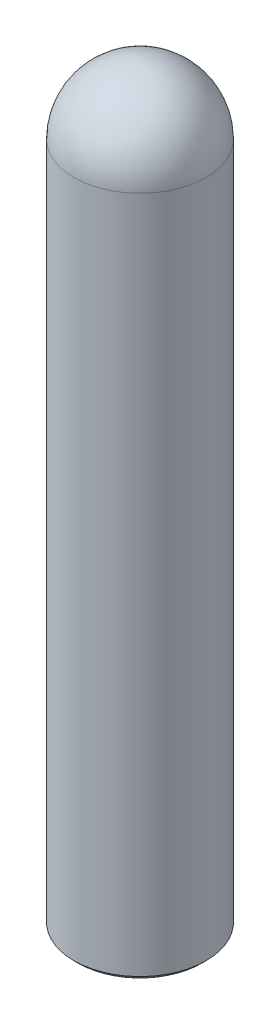
ISO-10303-21;
HEADER;
FILE_DESCRIPTION(('STEP AP214'),'2;1');
FILE_NAME('part.step','',(''),(''),'','','');
FILE_SCHEMA(('AUTOMOTIVE_DESIGN { 1 0 10303 214 1 1 1 1 }'));
ENDSEC;
DATA;
#1=APPLICATION_CONTEXT('core data for automotive mechanical design processes');
#2=APPLICATION_PROTOCOL_DEFINITION('international standard','automotive_design',2000,#1);
#3=PRODUCT_CONTEXT('',#1,'mechanical');
#4=PRODUCT('Part','Part','',(#3));
#5=PRODUCT_RELATED_PRODUCT_CATEGORY('part','',(#4));
#6=PRODUCT_DEFINITION_FORMATION('','',#4);
#7=PRODUCT_DEFINITION_CONTEXT('part definition',#1,'design');
#8=PRODUCT_DEFINITION('design','',#6,#7);
#9=PRODUCT_DEFINITION_SHAPE('','',#8);
#10=(LENGTH_UNIT() NAMED_UNIT(*) SI_UNIT(.MILLI.,.METRE.));
#11=(NAMED_UNIT(*) PLANE_ANGLE_UNIT() SI_UNIT($,.RADIAN.));
#12=(NAMED_UNIT(*) SI_UNIT($,.STERADIAN.) SOLID_ANGLE_UNIT());
#13=UNCERTAINTY_MEASURE_WITH_UNIT(LENGTH_MEASURE(1.E-05),#10,'distance_accuracy_value','');
#14=(GEOMETRIC_REPRESENTATION_CONTEXT(3) GLOBAL_UNCERTAINTY_ASSIGNED_CONTEXT((#13)) GLOBAL_UNIT_ASSIGNED_CONTEXT((#10,
#11,#12)) REPRESENTATION_CONTEXT('',''));
#15=CARTESIAN_POINT('',(0.,0.,0.));
#16=DIRECTION('',(0.,0.,1.));
#17=DIRECTION('',(1.,0.,0.));
#18=AXIS2_PLACEMENT_3D('',#15,#16,#17);
#19=CARTESIAN_POINT('',(0.,170.,0.));
#20=DIRECTION('',(0.,-1.,0.));
#21=DIRECTION('',(0.,0.,-1.));
#22=AXIS2_PLACEMENT_3D('',#19,#20,#21);
#23=CYLINDRICAL_SURFACE('',#22,15.);
#24=CARTESIAN_POINT('',(0.,1.00000000000003,0.));
#25=DIRECTION('',(0.,1.,0.));
#26=DIRECTION('',(0.,0.,1.));
#27=AXIS2_PLACEMENT_3D('',#24,#25,#26);
#28=CIRCLE('',#27,15.);
#29=CARTESIAN_POINT('',(0.,1.00000000000003,15.));
#30=VERTEX_POINT('',#29);
#31=EDGE_CURVE('E41',#30,#30,#28,.T.);
#32=ORIENTED_EDGE('',*,*,#31,.T.);
#33=EDGE_LOOP('',(#32));
#34=FACE_BOUND('',#33,.T.);
#35=CARTESIAN_POINT('',(0.,155.,0.));
#36=DIRECTION('',(0.,-1.,0.));
#37=DIRECTION('',(0.,0.,-1.));
#38=AXIS2_PLACEMENT_3D('',#35,#36,#37);
#39=CIRCLE('',#38,15.);
#40=CARTESIAN_POINT('',(0.,155.,-15.));
#41=VERTEX_POINT('',#40);
#42=EDGE_CURVE('E54',#41,#41,#39,.T.);
#43=ORIENTED_EDGE('',*,*,#42,.T.);
#44=EDGE_LOOP('',(#43));
#45=FACE_BOUND('',#44,.T.);
#46=ADVANCED_FACE('F33',(#34,#45),#23,.T.);
#47=CARTESIAN_POINT('',(0.,0.,0.));
#48=DIRECTION('',(0.,1.,0.));
#49=DIRECTION('',(0.,0.,1.));
#50=AXIS2_PLACEMENT_3D('',#47,#48,#49);
#51=PLANE('',#50);
#52=CARTESIAN_POINT('',(0.,0.,0.));
#53=DIRECTION('',(0.,1.,0.));
#54=DIRECTION('',(0.,0.,1.));
#55=AXIS2_PLACEMENT_3D('',#52,#53,#54);
#56=CIRCLE('',#55,14.);
#57=CARTESIAN_POINT('',(0.,0.,14.));
#58=VERTEX_POINT('',#57);
#59=EDGE_CURVE('E10',#58,#58,#56,.F.);
#60=ORIENTED_EDGE('',*,*,#59,.T.);
#61=EDGE_LOOP('',(#60));
#62=FACE_BOUND('',#61,.T.);
#63=CARTESIAN_POINT('',(0.,0.,0.));
#64=DIRECTION('',(0.,1.,0.));
#65=DIRECTION('',(0.,0.,1.));
#66=AXIS2_PLACEMENT_3D('',#63,#64,#65);
#67=CIRCLE('',#66,3.65);
#68=CARTESIAN_POINT('',(0.,0.,3.65));
#69=VERTEX_POINT('',#68);
#70=EDGE_CURVE('E45',#69,#69,#67,.T.);
#71=ORIENTED_EDGE('',*,*,#70,.T.);
#72=EDGE_LOOP('',(#71));
#73=FACE_BOUND('',#72,.T.);
#74=ADVANCED_FACE('F74',(#62,#73),#51,.F.);
#75=CARTESIAN_POINT('',(0.,155.,0.));
#76=DIRECTION('',(0.,1.,0.));
#77=DIRECTION('',(0.,0.,1.));
#78=AXIS2_PLACEMENT_3D('',#75,#76,#77);
#79=SPHERICAL_SURFACE('',#78,15.);
#80=ORIENTED_EDGE('',*,*,#42,.F.);
#81=EDGE_LOOP('',(#80));
#82=FACE_BOUND('',#81,.T.);
#83=ADVANCED_FACE('F65',(#82),#79,.T.);
#84=CARTESIAN_POINT('',(0.,9.6,0.));
#85=DIRECTION('',(0.,-1.,0.));
#86=DIRECTION('',(0.,0.,-1.));
#87=AXIS2_PLACEMENT_3D('',#84,#85,#86);
#88=CYLINDRICAL_SURFACE('',#87,3.25);
#89=CARTESIAN_POINT('',(0.,0.400000000000025,0.));
#90=DIRECTION('',(0.,1.,0.));
#91=DIRECTION('',(0.,0.,1.));
#92=AXIS2_PLACEMENT_3D('',#89,#90,#91);
#93=CIRCLE('',#92,3.25);
#94=CARTESIAN_POINT('',(0.,0.400000000000025,3.25));
#95=VERTEX_POINT('',#94);
#96=EDGE_CURVE('E49',#95,#95,#93,.F.);
#97=ORIENTED_EDGE('',*,*,#96,.T.);
#98=EDGE_LOOP('',(#97));
#99=FACE_BOUND('',#98,.T.);
#100=CARTESIAN_POINT('',(0.,9.6,0.));
#101=DIRECTION('',(0.,-1.,0.));
#102=DIRECTION('',(0.,0.,-1.));
#103=AXIS2_PLACEMENT_3D('',#100,#101,#102);
#104=CIRCLE('',#103,3.25);
#105=CARTESIAN_POINT('',(0.,9.6,-3.25));
#106=VERTEX_POINT('',#105);
#107=EDGE_CURVE('E57',#106,#106,#104,.T.);
#108=ORIENTED_EDGE('',*,*,#107,.F.);
#109=EDGE_LOOP('',(#108));
#110=FACE_BOUND('',#109,.T.);
#111=ADVANCED_FACE('F63',(#99,#110),#88,.F.);
#112=CARTESIAN_POINT('',(0.,9.6,0.));
#113=DIRECTION('',(0.,-1.,0.));
#114=DIRECTION('',(0.,0.,-1.));
#115=AXIS2_PLACEMENT_3D('',#112,#113,#114);
#116=PLANE('',#115);
#117=ORIENTED_EDGE('',*,*,#107,.T.);
#118=EDGE_LOOP('',(#117));
#119=FACE_BOUND('',#118,.T.);
#120=ADVANCED_FACE('F61',(#119),#116,.T.);
#121=CARTESIAN_POINT('',(0.,0.400000000000025,0.));
#122=DIRECTION('',(0.,-1.,0.));
#123=DIRECTION('',(0.,0.,-1.));
#124=AXIS2_PLACEMENT_3D('',#121,#122,#123);
#125=CONICAL_SURFACE('',#124,3.25,0.785398163397417);
#126=ORIENTED_EDGE('',*,*,#70,.F.);
#127=EDGE_LOOP('',(#126));
#128=FACE_BOUND('',#127,.T.);
#129=ORIENTED_EDGE('',*,*,#96,.F.);
#130=EDGE_LOOP('',(#129));
#131=FACE_BOUND('',#130,.T.);
#132=ADVANCED_FACE('F72',(#128,#131),#125,.F.);
#133=CARTESIAN_POINT('',(0.,1.00000000000003,0.));
#134=DIRECTION('',(0.,1.,0.));
#135=DIRECTION('',(0.,0.,1.));
#136=AXIS2_PLACEMENT_3D('',#133,#134,#135);
#137=CONICAL_SURFACE('',#136,15.,0.785398163397441);
#138=ORIENTED_EDGE('',*,*,#59,.F.);
#139=EDGE_LOOP('',(#138));
#140=FACE_BOUND('',#139,.T.);
#141=ORIENTED_EDGE('',*,*,#31,.F.);
#142=EDGE_LOOP('',(#141));
#143=FACE_BOUND('',#142,.T.);
#144=ADVANCED_FACE('F36',(#140,#143),#137,.T.);
#145=CLOSED_SHELL('',(#46,#74,#83,#111,#120,#132,#144));
#146=MANIFOLD_SOLID_BREP('B2',#145);
#147=ADVANCED_BREP_SHAPE_REPRESENTATION('',(#18,#146),#14);
#148=SHAPE_DEFINITION_REPRESENTATION(#9,#147);
ENDSEC;
END-ISO-10303-21;
